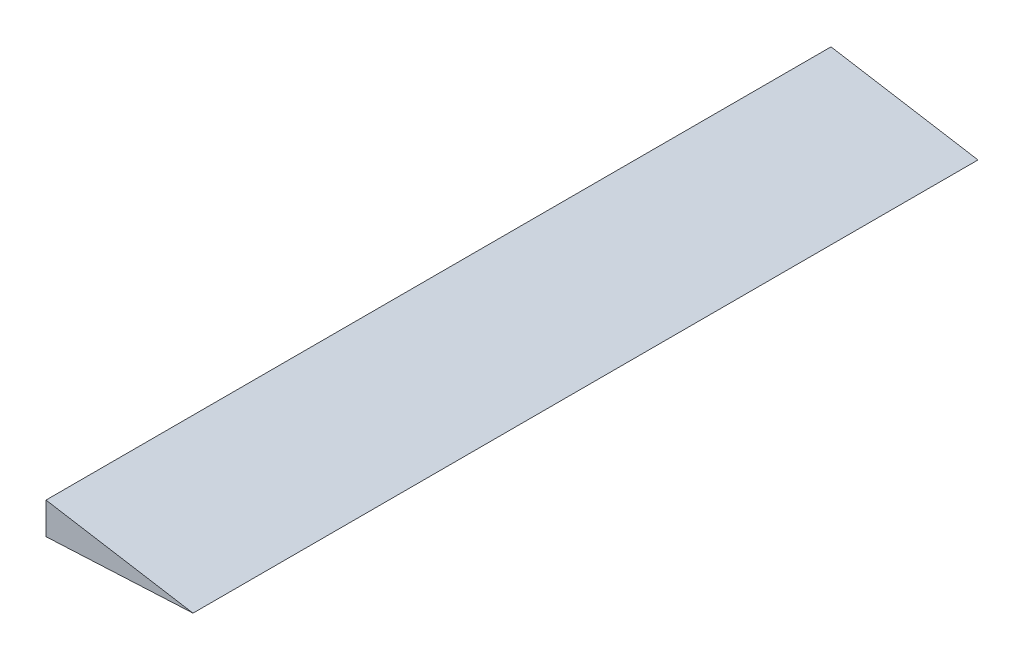
ISO-10303-21;
HEADER;
FILE_DESCRIPTION(('STEP AP214'),'2;1');
FILE_NAME('part.step','',(''),(''),'','','');
FILE_SCHEMA(('AUTOMOTIVE_DESIGN { 1 0 10303 214 1 1 1 1 }'));
ENDSEC;
DATA;
#1=APPLICATION_CONTEXT('core data for automotive mechanical design processes');
#2=APPLICATION_PROTOCOL_DEFINITION('international standard','automotive_design',2000,#1);
#3=PRODUCT_CONTEXT('',#1,'mechanical');
#4=PRODUCT('Part','Part','',(#3));
#5=PRODUCT_RELATED_PRODUCT_CATEGORY('part','',(#4));
#6=PRODUCT_DEFINITION_FORMATION('','',#4);
#7=PRODUCT_DEFINITION_CONTEXT('part definition',#1,'design');
#8=PRODUCT_DEFINITION('design','',#6,#7);
#9=PRODUCT_DEFINITION_SHAPE('','',#8);
#10=(LENGTH_UNIT() NAMED_UNIT(*) SI_UNIT(.MILLI.,.METRE.));
#11=(NAMED_UNIT(*) PLANE_ANGLE_UNIT() SI_UNIT($,.RADIAN.));
#12=(NAMED_UNIT(*) SI_UNIT($,.STERADIAN.) SOLID_ANGLE_UNIT());
#13=UNCERTAINTY_MEASURE_WITH_UNIT(LENGTH_MEASURE(1.E-05),#10,'distance_accuracy_value','');
#14=(GEOMETRIC_REPRESENTATION_CONTEXT(3) GLOBAL_UNCERTAINTY_ASSIGNED_CONTEXT((#13)) GLOBAL_UNIT_ASSIGNED_CONTEXT((#10,
#11,#12)) REPRESENTATION_CONTEXT('',''));
#15=CARTESIAN_POINT('',(0.,0.,0.));
#16=DIRECTION('',(0.,0.,1.));
#17=DIRECTION('',(1.,0.,0.));
#18=AXIS2_PLACEMENT_3D('',#15,#16,#17);
#19=CARTESIAN_POINT('',(306.849576799999,-2.51611574111238,-490.727746));
#20=DIRECTION('',(0.0494691955585382,-0.998775649828724,0.));
#21=DIRECTION('',(0.998775649828725,0.0494691955585382,0.));
#22=AXIS2_PLACEMENT_3D('',#19,#20,#21);
#23=PLANE('',#22);
#24=DIRECTION('',(-0.998775649828725,-0.0494691955585382,0.));
#25=VECTOR('',#24,1.);
#26=CARTESIAN_POINT('',(306.849576799999,-2.51611574111238,-761.999746));
#27=LINE('',#26,#25);
#28=CARTESIAN_POINT('',(357.6495768,0.,-761.999746));
#29=VERTEX_POINT('',#28);
#30=CARTESIAN_POINT('',(306.849576799999,-2.51611574111238,-761.999746));
#31=VERTEX_POINT('',#30);
#32=EDGE_CURVE('E93',#29,#31,#27,.T.);
#33=ORIENTED_EDGE('',*,*,#32,.F.);
#34=DIRECTION('',(0.,0.,-1.));
#35=VECTOR('',#34,1.);
#36=CARTESIAN_POINT('',(357.6495768,0.,-490.727746));
#37=LINE('',#36,#35);
#38=CARTESIAN_POINT('',(357.6495768,0.,-490.727746));
#39=VERTEX_POINT('',#38);
#40=EDGE_CURVE('E11',#39,#29,#37,.T.);
#41=ORIENTED_EDGE('',*,*,#40,.F.);
#42=DIRECTION('',(-0.998775649828725,-0.0494691955585382,0.));
#43=VECTOR('',#42,1.);
#44=CARTESIAN_POINT('',(306.849576799999,-2.51611574111238,-490.727746));
#45=LINE('',#44,#43);
#46=CARTESIAN_POINT('',(306.849576799999,-2.51611574111238,-490.727746));
#47=VERTEX_POINT('',#46);
#48=EDGE_CURVE('E85',#39,#47,#45,.T.);
#49=ORIENTED_EDGE('',*,*,#48,.T.);
#50=DIRECTION('',(0.,0.,-1.));
#51=VECTOR('',#50,1.);
#52=CARTESIAN_POINT('',(306.849576799999,-2.51611574111238,-490.727746));
#53=LINE('',#52,#51);
#54=EDGE_CURVE('E44',#47,#31,#53,.T.);
#55=ORIENTED_EDGE('',*,*,#54,.T.);
#56=EDGE_LOOP('',(#33,#41,#49,#55));
#57=FACE_BOUND('',#56,.T.);
#58=ADVANCED_FACE('F41',(#57),#23,.T.);
#59=CARTESIAN_POINT('',(306.8495768,8.44985600136988,-490.727746));
#60=DIRECTION('',(0.164081367708129,0.986446807877156,0.));
#61=DIRECTION('',(-0.986446807877156,0.164081367708129,0.));
#62=AXIS2_PLACEMENT_3D('',#59,#60,#61);
#63=PLANE('',#62);
#64=DIRECTION('',(0.986446807877156,-0.164081367708129,0.));
#65=VECTOR('',#64,1.);
#66=CARTESIAN_POINT('',(306.8495768,8.44985600136988,-761.999746));
#67=LINE('',#66,#65);
#68=CARTESIAN_POINT('',(306.8495768,8.44985600136988,-761.999746));
#69=VERTEX_POINT('',#68);
#70=EDGE_CURVE('E87',#69,#29,#67,.T.);
#71=ORIENTED_EDGE('',*,*,#70,.F.);
#72=DIRECTION('',(0.,0.,-1.));
#73=VECTOR('',#72,1.);
#74=CARTESIAN_POINT('',(306.8495768,8.44985600136988,-490.727746));
#75=LINE('',#74,#73);
#76=CARTESIAN_POINT('',(306.8495768,8.44985600136988,-490.727746));
#77=VERTEX_POINT('',#76);
#78=EDGE_CURVE('E50',#77,#69,#75,.T.);
#79=ORIENTED_EDGE('',*,*,#78,.F.);
#80=DIRECTION('',(0.986446807877156,-0.164081367708129,0.));
#81=VECTOR('',#80,1.);
#82=CARTESIAN_POINT('',(306.8495768,8.44985600136988,-490.727746));
#83=LINE('',#82,#81);
#84=EDGE_CURVE('E82',#77,#39,#83,.T.);
#85=ORIENTED_EDGE('',*,*,#84,.T.);
#86=ORIENTED_EDGE('',*,*,#40,.T.);
#87=EDGE_LOOP('',(#71,#79,#85,#86));
#88=FACE_BOUND('',#87,.T.);
#89=ADVANCED_FACE('F97',(#88),#63,.T.);
#90=CARTESIAN_POINT('',(306.849576799999,-2.51611574111238,-490.727746));
#91=DIRECTION('',(-1.,1.16428941119077E-13,0.));
#92=DIRECTION('',(-1.16428941119077E-13,-1.,0.));
#93=AXIS2_PLACEMENT_3D('',#90,#91,#92);
#94=PLANE('',#93);
#95=DIRECTION('',(1.16428941119077E-13,1.,0.));
#96=VECTOR('',#95,1.);
#97=CARTESIAN_POINT('',(306.849576799999,-2.51611574111238,-761.999746));
#98=LINE('',#97,#96);
#99=EDGE_CURVE('E80',#31,#69,#98,.T.);
#100=ORIENTED_EDGE('',*,*,#99,.F.);
#101=ORIENTED_EDGE('',*,*,#54,.F.);
#102=DIRECTION('',(1.16428941119077E-13,1.,0.));
#103=VECTOR('',#102,1.);
#104=CARTESIAN_POINT('',(306.849576799999,-2.51611574111238,-490.727746));
#105=LINE('',#104,#103);
#106=EDGE_CURVE('E78',#47,#77,#105,.T.);
#107=ORIENTED_EDGE('',*,*,#106,.T.);
#108=ORIENTED_EDGE('',*,*,#78,.T.);
#109=EDGE_LOOP('',(#100,#101,#107,#108));
#110=FACE_BOUND('',#109,.T.);
#111=ADVANCED_FACE('F77',(#110),#94,.T.);
#112=CARTESIAN_POINT('',(0.,0.,-490.727746));
#113=DIRECTION('',(0.,0.,1.));
#114=DIRECTION('',(1.,0.,0.));
#115=AXIS2_PLACEMENT_3D('',#112,#113,#114);
#116=PLANE('',#115);
#117=ORIENTED_EDGE('',*,*,#48,.F.);
#118=ORIENTED_EDGE('',*,*,#84,.F.);
#119=ORIENTED_EDGE('',*,*,#106,.F.);
#120=EDGE_LOOP('',(#117,#118,#119));
#121=FACE_BOUND('',#120,.T.);
#122=ADVANCED_FACE('F84',(#121),#116,.T.);
#123=CARTESIAN_POINT('',(0.,0.,-761.999746));
#124=DIRECTION('',(0.,0.,1.));
#125=DIRECTION('',(1.,0.,0.));
#126=AXIS2_PLACEMENT_3D('',#123,#124,#125);
#127=PLANE('',#126);
#128=ORIENTED_EDGE('',*,*,#32,.T.);
#129=ORIENTED_EDGE('',*,*,#99,.T.);
#130=ORIENTED_EDGE('',*,*,#70,.T.);
#131=EDGE_LOOP('',(#128,#129,#130));
#132=FACE_BOUND('',#131,.T.);
#133=ADVANCED_FACE('F96',(#132),#127,.F.);
#134=CLOSED_SHELL('',(#58,#89,#111,#122,#133));
#135=MANIFOLD_SOLID_BREP('B2',#134);
#136=ADVANCED_BREP_SHAPE_REPRESENTATION('',(#18,#135),#14);
#137=SHAPE_DEFINITION_REPRESENTATION(#9,#136);
ENDSEC;
END-ISO-10303-21;
